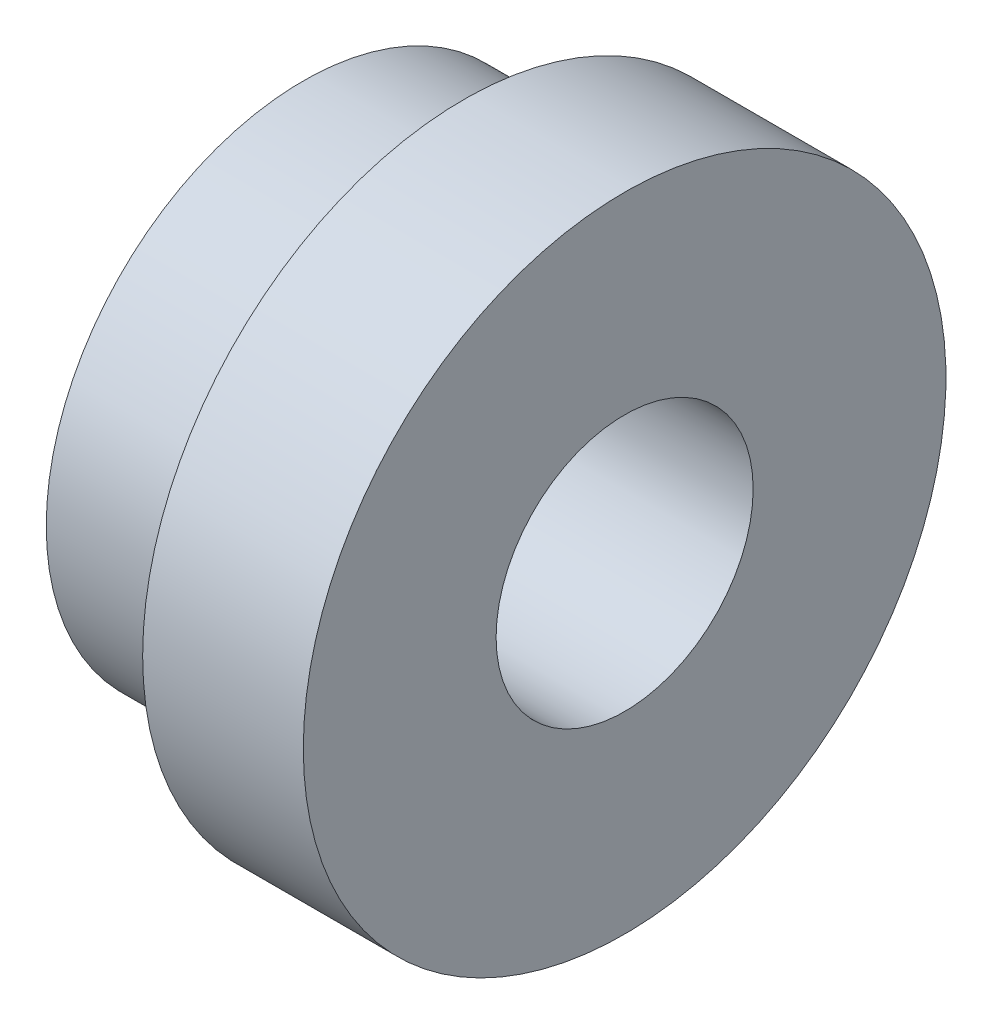
ISO-10303-21;
HEADER;
FILE_DESCRIPTION(('STEP AP214'),'2;1');
FILE_NAME('part.step','',(''),(''),'','','');
FILE_SCHEMA(('AUTOMOTIVE_DESIGN { 1 0 10303 214 1 1 1 1 }'));
ENDSEC;
DATA;
#1=APPLICATION_CONTEXT('core data for automotive mechanical design processes');
#2=APPLICATION_PROTOCOL_DEFINITION('international standard','automotive_design',2000,#1);
#3=PRODUCT_CONTEXT('',#1,'mechanical');
#4=PRODUCT('Part','Part','',(#3));
#5=PRODUCT_RELATED_PRODUCT_CATEGORY('part','',(#4));
#6=PRODUCT_DEFINITION_FORMATION('','',#4);
#7=PRODUCT_DEFINITION_CONTEXT('part definition',#1,'design');
#8=PRODUCT_DEFINITION('design','',#6,#7);
#9=PRODUCT_DEFINITION_SHAPE('','',#8);
#10=(LENGTH_UNIT() NAMED_UNIT(*) SI_UNIT(.MILLI.,.METRE.));
#11=(NAMED_UNIT(*) PLANE_ANGLE_UNIT() SI_UNIT($,.RADIAN.));
#12=(NAMED_UNIT(*) SI_UNIT($,.STERADIAN.) SOLID_ANGLE_UNIT());
#13=UNCERTAINTY_MEASURE_WITH_UNIT(LENGTH_MEASURE(1.E-05),#10,'distance_accuracy_value','');
#14=(GEOMETRIC_REPRESENTATION_CONTEXT(3) GLOBAL_UNCERTAINTY_ASSIGNED_CONTEXT((#13)) GLOBAL_UNIT_ASSIGNED_CONTEXT((#10,
#11,#12)) REPRESENTATION_CONTEXT('',''));
#15=CARTESIAN_POINT('',(0.,0.,0.));
#16=DIRECTION('',(0.,0.,1.));
#17=DIRECTION('',(1.,0.,0.));
#18=AXIS2_PLACEMENT_3D('',#15,#16,#17);
#19=CARTESIAN_POINT('',(0.,0.,0.));
#20=DIRECTION('',(-1.,0.,0.));
#21=DIRECTION('',(0.,0.,1.));
#22=AXIS2_PLACEMENT_3D('',#19,#20,#21);
#23=CYLINDRICAL_SURFACE('',#22,1.6);
#24=CARTESIAN_POINT('',(0.,0.,0.));
#25=DIRECTION('',(-1.,0.,0.));
#26=DIRECTION('',(0.,0.,1.));
#27=AXIS2_PLACEMENT_3D('',#24,#25,#26);
#28=CIRCLE('',#27,1.6);
#29=CARTESIAN_POINT('',(0.,0.,1.6));
#30=VERTEX_POINT('',#29);
#31=EDGE_CURVE('E10',#30,#30,#28,.T.);
#32=ORIENTED_EDGE('',*,*,#31,.F.);
#33=EDGE_LOOP('',(#32));
#34=FACE_BOUND('',#33,.T.);
#35=CARTESIAN_POINT('',(1.,0.,0.));
#36=DIRECTION('',(-1.,0.,0.));
#37=DIRECTION('',(0.,0.,1.));
#38=AXIS2_PLACEMENT_3D('',#35,#36,#37);
#39=CIRCLE('',#38,1.6);
#40=CARTESIAN_POINT('',(1.,0.,1.6));
#41=VERTEX_POINT('',#40);
#42=EDGE_CURVE('E55',#41,#41,#39,.T.);
#43=ORIENTED_EDGE('',*,*,#42,.T.);
#44=EDGE_LOOP('',(#43));
#45=FACE_BOUND('',#44,.T.);
#46=ADVANCED_FACE('F33',(#34,#45),#23,.T.);
#47=CARTESIAN_POINT('',(0.,0.8,0.));
#48=DIRECTION('',(1.,0.,0.));
#49=DIRECTION('',(0.,0.,-1.));
#50=AXIS2_PLACEMENT_3D('',#47,#48,#49);
#51=PLANE('',#50);
#52=CARTESIAN_POINT('',(0.,0.,0.));
#53=DIRECTION('',(-1.,0.,0.));
#54=DIRECTION('',(0.,0.,1.));
#55=AXIS2_PLACEMENT_3D('',#52,#53,#54);
#56=CIRCLE('',#55,0.8);
#57=CARTESIAN_POINT('',(0.,0.,0.8));
#58=VERTEX_POINT('',#57);
#59=EDGE_CURVE('E39',#58,#58,#56,.T.);
#60=ORIENTED_EDGE('',*,*,#59,.F.);
#61=EDGE_LOOP('',(#60));
#62=FACE_BOUND('',#61,.T.);
#63=ORIENTED_EDGE('',*,*,#31,.T.);
#64=EDGE_LOOP('',(#63));
#65=FACE_BOUND('',#64,.T.);
#66=ADVANCED_FACE('F80',(#62,#65),#51,.F.);
#67=CARTESIAN_POINT('',(0.,0.,0.));
#68=DIRECTION('',(-1.,0.,0.));
#69=DIRECTION('',(0.,0.,1.));
#70=AXIS2_PLACEMENT_3D('',#67,#68,#69);
#71=CYLINDRICAL_SURFACE('',#70,0.8);
#72=CARTESIAN_POINT('',(2.,0.,0.));
#73=DIRECTION('',(-1.,0.,0.));
#74=DIRECTION('',(0.,0.,1.));
#75=AXIS2_PLACEMENT_3D('',#72,#73,#74);
#76=CIRCLE('',#75,0.8);
#77=CARTESIAN_POINT('',(2.,0.,0.8));
#78=VERTEX_POINT('',#77);
#79=EDGE_CURVE('E43',#78,#78,#76,.T.);
#80=ORIENTED_EDGE('',*,*,#79,.F.);
#81=EDGE_LOOP('',(#80));
#82=FACE_BOUND('',#81,.T.);
#83=ORIENTED_EDGE('',*,*,#59,.T.);
#84=EDGE_LOOP('',(#83));
#85=FACE_BOUND('',#84,.T.);
#86=ADVANCED_FACE('F75',(#82,#85),#71,.F.);
#87=CARTESIAN_POINT('',(2.,2.,0.));
#88=DIRECTION('',(-1.,0.,0.));
#89=DIRECTION('',(0.,0.,1.));
#90=AXIS2_PLACEMENT_3D('',#87,#88,#89);
#91=PLANE('',#90);
#92=CARTESIAN_POINT('',(2.,0.,0.));
#93=DIRECTION('',(-1.,0.,0.));
#94=DIRECTION('',(0.,0.,1.));
#95=AXIS2_PLACEMENT_3D('',#92,#93,#94);
#96=CIRCLE('',#95,2.);
#97=CARTESIAN_POINT('',(2.,0.,2.));
#98=VERTEX_POINT('',#97);
#99=EDGE_CURVE('E47',#98,#98,#96,.T.);
#100=ORIENTED_EDGE('',*,*,#99,.F.);
#101=EDGE_LOOP('',(#100));
#102=FACE_BOUND('',#101,.T.);
#103=ORIENTED_EDGE('',*,*,#79,.T.);
#104=EDGE_LOOP('',(#103));
#105=FACE_BOUND('',#104,.T.);
#106=ADVANCED_FACE('F69',(#102,#105),#91,.F.);
#107=CARTESIAN_POINT('',(0.,0.,0.));
#108=DIRECTION('',(-1.,0.,0.));
#109=DIRECTION('',(0.,0.,1.));
#110=AXIS2_PLACEMENT_3D('',#107,#108,#109);
#111=CYLINDRICAL_SURFACE('',#110,2.);
#112=CARTESIAN_POINT('',(1.,0.,0.));
#113=DIRECTION('',(-1.,0.,0.));
#114=DIRECTION('',(0.,0.,1.));
#115=AXIS2_PLACEMENT_3D('',#112,#113,#114);
#116=CIRCLE('',#115,2.);
#117=CARTESIAN_POINT('',(1.,0.,2.));
#118=VERTEX_POINT('',#117);
#119=EDGE_CURVE('E52',#118,#118,#116,.T.);
#120=ORIENTED_EDGE('',*,*,#119,.F.);
#121=EDGE_LOOP('',(#120));
#122=FACE_BOUND('',#121,.T.);
#123=ORIENTED_EDGE('',*,*,#99,.T.);
#124=EDGE_LOOP('',(#123));
#125=FACE_BOUND('',#124,.T.);
#126=ADVANCED_FACE('F63',(#122,#125),#111,.T.);
#127=CARTESIAN_POINT('',(1.,1.6,0.));
#128=DIRECTION('',(1.,0.,0.));
#129=DIRECTION('',(0.,0.,-1.));
#130=AXIS2_PLACEMENT_3D('',#127,#128,#129);
#131=PLANE('',#130);
#132=ORIENTED_EDGE('',*,*,#42,.F.);
#133=EDGE_LOOP('',(#132));
#134=FACE_BOUND('',#133,.T.);
#135=ORIENTED_EDGE('',*,*,#119,.T.);
#136=EDGE_LOOP('',(#135));
#137=FACE_BOUND('',#136,.T.);
#138=ADVANCED_FACE('F60',(#134,#137),#131,.F.);
#139=CLOSED_SHELL('',(#46,#66,#86,#106,#126,#138));
#140=MANIFOLD_SOLID_BREP('B2',#139);
#141=ADVANCED_BREP_SHAPE_REPRESENTATION('',(#18,#140),#14);
#142=SHAPE_DEFINITION_REPRESENTATION(#9,#141);
ENDSEC;
END-ISO-10303-21;
